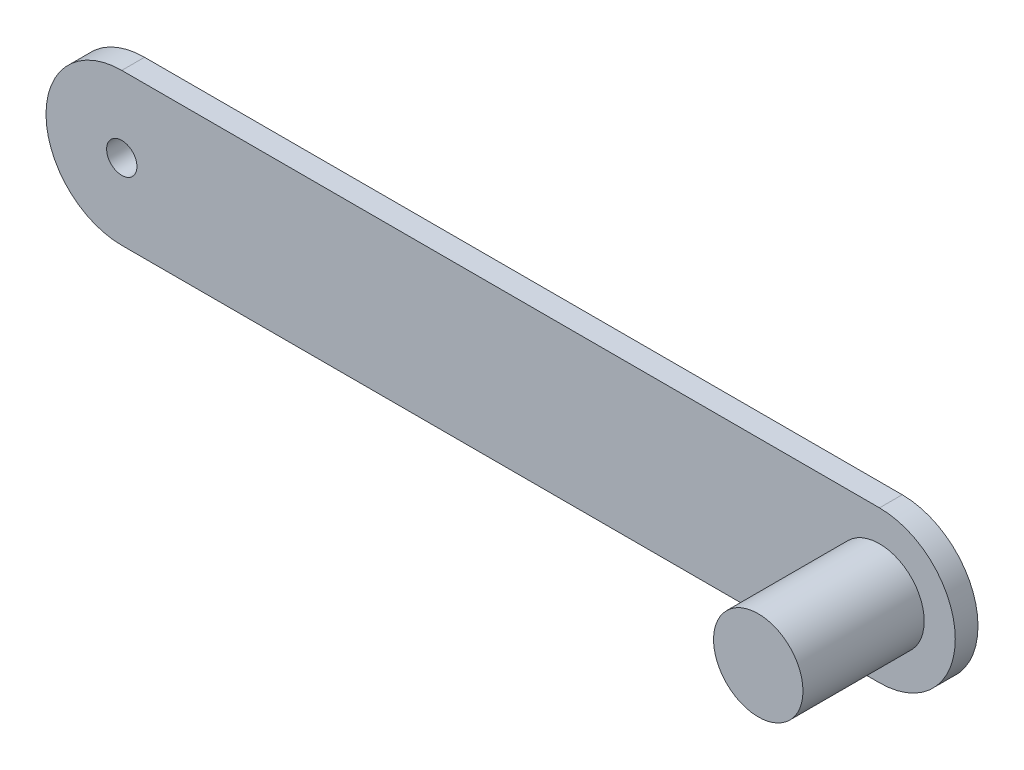
ISO-10303-21;
HEADER;
FILE_DESCRIPTION(('STEP AP214'),'2;1');
FILE_NAME('part.step','',(''),(''),'','','');
FILE_SCHEMA(('AUTOMOTIVE_DESIGN { 1 0 10303 214 1 1 1 1 }'));
ENDSEC;
DATA;
#1=APPLICATION_CONTEXT('core data for automotive mechanical design processes');
#2=APPLICATION_PROTOCOL_DEFINITION('international standard','automotive_design',2000,#1);
#3=PRODUCT_CONTEXT('',#1,'mechanical');
#4=PRODUCT('Part','Part','',(#3));
#5=PRODUCT_RELATED_PRODUCT_CATEGORY('part','',(#4));
#6=PRODUCT_DEFINITION_FORMATION('','',#4);
#7=PRODUCT_DEFINITION_CONTEXT('part definition',#1,'design');
#8=PRODUCT_DEFINITION('design','',#6,#7);
#9=PRODUCT_DEFINITION_SHAPE('','',#8);
#10=(LENGTH_UNIT() NAMED_UNIT(*) SI_UNIT(.MILLI.,.METRE.));
#11=(NAMED_UNIT(*) PLANE_ANGLE_UNIT() SI_UNIT($,.RADIAN.));
#12=(NAMED_UNIT(*) SI_UNIT($,.STERADIAN.) SOLID_ANGLE_UNIT());
#13=UNCERTAINTY_MEASURE_WITH_UNIT(LENGTH_MEASURE(1.E-05),#10,'distance_accuracy_value','');
#14=(GEOMETRIC_REPRESENTATION_CONTEXT(3) GLOBAL_UNCERTAINTY_ASSIGNED_CONTEXT((#13)) GLOBAL_UNIT_ASSIGNED_CONTEXT((#10,
#11,#12)) REPRESENTATION_CONTEXT('',''));
#15=CARTESIAN_POINT('',(0.,0.,0.));
#16=DIRECTION('',(0.,0.,1.));
#17=DIRECTION('',(1.,0.,0.));
#18=AXIS2_PLACEMENT_3D('',#15,#16,#17);
#19=CARTESIAN_POINT('',(0.,0.,1.5));
#20=DIRECTION('',(0.,0.,-1.));
#21=DIRECTION('',(-1.,0.,0.));
#22=AXIS2_PLACEMENT_3D('',#19,#20,#21);
#23=CYLINDRICAL_SURFACE('',#22,5.);
#24=CARTESIAN_POINT('',(0.,0.,0.));
#25=DIRECTION('',(0.,0.,1.));
#26=DIRECTION('',(1.,0.,0.));
#27=AXIS2_PLACEMENT_3D('',#24,#25,#26);
#28=CIRCLE('',#27,5.);
#29=CARTESIAN_POINT('',(0.,5.,0.));
#30=VERTEX_POINT('',#29);
#31=CARTESIAN_POINT('',(0.,-5.,0.));
#32=VERTEX_POINT('',#31);
#33=EDGE_CURVE('E107',#30,#32,#28,.T.);
#34=ORIENTED_EDGE('',*,*,#33,.T.);
#35=DIRECTION('',(0.,0.,-1.));
#36=VECTOR('',#35,1.);
#37=CARTESIAN_POINT('',(0.,-5.,1.5));
#38=LINE('',#37,#36);
#39=CARTESIAN_POINT('',(0.,-5.,1.5));
#40=VERTEX_POINT('',#39);
#41=EDGE_CURVE('E11',#40,#32,#38,.T.);
#42=ORIENTED_EDGE('',*,*,#41,.F.);
#43=CARTESIAN_POINT('',(0.,0.,1.5));
#44=DIRECTION('',(0.,0.,1.));
#45=DIRECTION('',(1.,0.,0.));
#46=AXIS2_PLACEMENT_3D('',#43,#44,#45);
#47=CIRCLE('',#46,5.);
#48=CARTESIAN_POINT('',(0.,5.,1.5));
#49=VERTEX_POINT('',#48);
#50=EDGE_CURVE('E91',#49,#40,#47,.T.);
#51=ORIENTED_EDGE('',*,*,#50,.F.);
#52=DIRECTION('',(0.,0.,-1.));
#53=VECTOR('',#52,1.);
#54=CARTESIAN_POINT('',(0.,5.,1.5));
#55=LINE('',#54,#53);
#56=EDGE_CURVE('E103',#49,#30,#55,.T.);
#57=ORIENTED_EDGE('',*,*,#56,.T.);
#58=EDGE_LOOP('',(#34,#42,#51,#57));
#59=FACE_BOUND('',#58,.T.);
#60=ADVANCED_FACE('F39',(#59),#23,.T.);
#61=CARTESIAN_POINT('',(0.,-5.,1.5));
#62=DIRECTION('',(0.,1.,0.));
#63=DIRECTION('',(-1.,0.,0.));
#64=AXIS2_PLACEMENT_3D('',#61,#62,#63);
#65=PLANE('',#64);
#66=DIRECTION('',(1.,0.,0.));
#67=VECTOR('',#66,1.);
#68=CARTESIAN_POINT('',(0.,-5.,0.));
#69=LINE('',#68,#67);
#70=CARTESIAN_POINT('',(50.,-5.,0.));
#71=VERTEX_POINT('',#70);
#72=EDGE_CURVE('E96',#32,#71,#69,.T.);
#73=ORIENTED_EDGE('',*,*,#72,.T.);
#74=DIRECTION('',(0.,0.,-1.));
#75=VECTOR('',#74,1.);
#76=CARTESIAN_POINT('',(50.,-5.,1.5));
#77=LINE('',#76,#75);
#78=CARTESIAN_POINT('',(50.,-5.,1.5));
#79=VERTEX_POINT('',#78);
#80=EDGE_CURVE('E48',#79,#71,#77,.T.);
#81=ORIENTED_EDGE('',*,*,#80,.F.);
#82=DIRECTION('',(1.,0.,0.));
#83=VECTOR('',#82,1.);
#84=CARTESIAN_POINT('',(0.,-5.,1.5));
#85=LINE('',#84,#83);
#86=EDGE_CURVE('E86',#40,#79,#85,.T.);
#87=ORIENTED_EDGE('',*,*,#86,.F.);
#88=ORIENTED_EDGE('',*,*,#41,.T.);
#89=EDGE_LOOP('',(#73,#81,#87,#88));
#90=FACE_BOUND('',#89,.T.);
#91=ADVANCED_FACE('F95',(#90),#65,.F.);
#92=CARTESIAN_POINT('',(50.,0.,1.5));
#93=DIRECTION('',(0.,0.,-1.));
#94=DIRECTION('',(-1.,0.,0.));
#95=AXIS2_PLACEMENT_3D('',#92,#93,#94);
#96=CYLINDRICAL_SURFACE('',#95,5.);
#97=CARTESIAN_POINT('',(50.,0.,0.));
#98=DIRECTION('',(0.,0.,1.));
#99=DIRECTION('',(1.,0.,0.));
#100=AXIS2_PLACEMENT_3D('',#97,#98,#99);
#101=CIRCLE('',#100,5.);
#102=CARTESIAN_POINT('',(50.,5.,0.));
#103=VERTEX_POINT('',#102);
#104=EDGE_CURVE('E73',#71,#103,#101,.T.);
#105=ORIENTED_EDGE('',*,*,#104,.T.);
#106=DIRECTION('',(0.,0.,-1.));
#107=VECTOR('',#106,1.);
#108=CARTESIAN_POINT('',(50.,5.,1.5));
#109=LINE('',#108,#107);
#110=CARTESIAN_POINT('',(50.,5.,1.5));
#111=VERTEX_POINT('',#110);
#112=EDGE_CURVE('E98',#111,#103,#109,.T.);
#113=ORIENTED_EDGE('',*,*,#112,.F.);
#114=CARTESIAN_POINT('',(50.,0.,1.5));
#115=DIRECTION('',(0.,0.,1.));
#116=DIRECTION('',(1.,0.,0.));
#117=AXIS2_PLACEMENT_3D('',#114,#115,#116);
#118=CIRCLE('',#117,5.);
#119=EDGE_CURVE('E89',#79,#111,#118,.T.);
#120=ORIENTED_EDGE('',*,*,#119,.F.);
#121=ORIENTED_EDGE('',*,*,#80,.T.);
#122=EDGE_LOOP('',(#105,#113,#120,#121));
#123=FACE_BOUND('',#122,.T.);
#124=ADVANCED_FACE('F99',(#123),#96,.T.);
#125=CARTESIAN_POINT('',(0.,5.,1.5));
#126=DIRECTION('',(0.,-1.,0.));
#127=DIRECTION('',(0.,0.,-1.));
#128=AXIS2_PLACEMENT_3D('',#125,#126,#127);
#129=PLANE('',#128);
#130=DIRECTION('',(-1.,0.,0.));
#131=VECTOR('',#130,1.);
#132=CARTESIAN_POINT('',(0.,5.,0.));
#133=LINE('',#132,#131);
#134=EDGE_CURVE('E79',#103,#30,#133,.T.);
#135=ORIENTED_EDGE('',*,*,#134,.T.);
#136=ORIENTED_EDGE('',*,*,#56,.F.);
#137=DIRECTION('',(-1.,0.,0.));
#138=VECTOR('',#137,1.);
#139=CARTESIAN_POINT('',(0.,5.,1.5));
#140=LINE('',#139,#138);
#141=EDGE_CURVE('E56',#111,#49,#140,.T.);
#142=ORIENTED_EDGE('',*,*,#141,.F.);
#143=ORIENTED_EDGE('',*,*,#112,.T.);
#144=EDGE_LOOP('',(#135,#136,#142,#143));
#145=FACE_BOUND('',#144,.T.);
#146=ADVANCED_FACE('F121',(#145),#129,.F.);
#147=CARTESIAN_POINT('',(0.,0.,1.5));
#148=DIRECTION('',(0.,0.,1.));
#149=DIRECTION('',(1.,0.,0.));
#150=AXIS2_PLACEMENT_3D('',#147,#148,#149);
#151=PLANE('',#150);
#152=CARTESIAN_POINT('',(50.,0.,1.5));
#153=DIRECTION('',(0.,0.,1.));
#154=DIRECTION('',(1.,0.,0.));
#155=AXIS2_PLACEMENT_3D('',#152,#153,#154);
#156=CIRCLE('',#155,2.95);
#157=CARTESIAN_POINT('',(52.95,0.,1.5));
#158=VERTEX_POINT('',#157);
#159=EDGE_CURVE('E136',#158,#158,#156,.T.);
#160=ORIENTED_EDGE('',*,*,#159,.F.);
#161=EDGE_LOOP('',(#160));
#162=FACE_BOUND('',#161,.T.);
#163=CARTESIAN_POINT('',(0.,0.,1.5));
#164=DIRECTION('',(0.,0.,1.));
#165=DIRECTION('',(1.,0.,0.));
#166=AXIS2_PLACEMENT_3D('',#163,#164,#165);
#167=CIRCLE('',#166,1.);
#168=CARTESIAN_POINT('',(1.,0.,1.5));
#169=VERTEX_POINT('',#168);
#170=EDGE_CURVE('E128',#169,#169,#167,.T.);
#171=ORIENTED_EDGE('',*,*,#170,.F.);
#172=EDGE_LOOP('',(#171));
#173=FACE_BOUND('',#172,.T.);
#174=ORIENTED_EDGE('',*,*,#50,.T.);
#175=ORIENTED_EDGE('',*,*,#86,.T.);
#176=ORIENTED_EDGE('',*,*,#119,.T.);
#177=ORIENTED_EDGE('',*,*,#141,.T.);
#178=EDGE_LOOP('',(#174,#175,#176,#177));
#179=FACE_BOUND('',#178,.T.);
#180=ADVANCED_FACE('F87',(#162,#173,#179),#151,.T.);
#181=CARTESIAN_POINT('',(0.,0.,0.));
#182=DIRECTION('',(0.,0.,1.));
#183=DIRECTION('',(1.,0.,0.));
#184=AXIS2_PLACEMENT_3D('',#181,#182,#183);
#185=PLANE('',#184);
#186=CARTESIAN_POINT('',(0.,0.,0.));
#187=DIRECTION('',(0.,0.,1.));
#188=DIRECTION('',(1.,0.,0.));
#189=AXIS2_PLACEMENT_3D('',#186,#187,#188);
#190=CIRCLE('',#189,1.);
#191=CARTESIAN_POINT('',(1.,0.,0.));
#192=VERTEX_POINT('',#191);
#193=EDGE_CURVE('E111',#192,#192,#190,.T.);
#194=ORIENTED_EDGE('',*,*,#193,.T.);
#195=EDGE_LOOP('',(#194));
#196=FACE_BOUND('',#195,.T.);
#197=ORIENTED_EDGE('',*,*,#33,.F.);
#198=ORIENTED_EDGE('',*,*,#134,.F.);
#199=ORIENTED_EDGE('',*,*,#104,.F.);
#200=ORIENTED_EDGE('',*,*,#72,.F.);
#201=EDGE_LOOP('',(#197,#198,#199,#200));
#202=FACE_BOUND('',#201,.T.);
#203=ADVANCED_FACE('F124',(#196,#202),#185,.F.);
#204=CARTESIAN_POINT('',(0.,0.,0.));
#205=DIRECTION('',(0.,0.,1.));
#206=DIRECTION('',(1.,0.,0.));
#207=AXIS2_PLACEMENT_3D('',#204,#205,#206);
#208=CYLINDRICAL_SURFACE('',#207,1.);
#209=ORIENTED_EDGE('',*,*,#193,.F.);
#210=EDGE_LOOP('',(#209));
#211=FACE_BOUND('',#210,.T.);
#212=ORIENTED_EDGE('',*,*,#170,.T.);
#213=EDGE_LOOP('',(#212));
#214=FACE_BOUND('',#213,.T.);
#215=ADVANCED_FACE('F149',(#211,#214),#208,.F.);
#216=CARTESIAN_POINT('',(50.,0.,9.5));
#217=DIRECTION('',(0.,0.,-1.));
#218=DIRECTION('',(-1.,0.,0.));
#219=AXIS2_PLACEMENT_3D('',#216,#217,#218);
#220=CYLINDRICAL_SURFACE('',#219,2.95);
#221=CARTESIAN_POINT('',(50.,0.,9.5));
#222=DIRECTION('',(0.,0.,1.));
#223=DIRECTION('',(1.,0.,0.));
#224=AXIS2_PLACEMENT_3D('',#221,#222,#223);
#225=CIRCLE('',#224,2.95);
#226=CARTESIAN_POINT('',(52.95,0.,9.5));
#227=VERTEX_POINT('',#226);
#228=EDGE_CURVE('E132',#227,#227,#225,.T.);
#229=ORIENTED_EDGE('',*,*,#228,.F.);
#230=EDGE_LOOP('',(#229));
#231=FACE_BOUND('',#230,.T.);
#232=ORIENTED_EDGE('',*,*,#159,.T.);
#233=EDGE_LOOP('',(#232));
#234=FACE_BOUND('',#233,.T.);
#235=ADVANCED_FACE('F146',(#231,#234),#220,.T.);
#236=CARTESIAN_POINT('',(50.,0.,9.5));
#237=DIRECTION('',(0.,0.,1.));
#238=DIRECTION('',(1.,0.,0.));
#239=AXIS2_PLACEMENT_3D('',#236,#237,#238);
#240=PLANE('',#239);
#241=ORIENTED_EDGE('',*,*,#228,.T.);
#242=EDGE_LOOP('',(#241));
#243=FACE_BOUND('',#242,.T.);
#244=ADVANCED_FACE('F144',(#243),#240,.T.);
#245=CLOSED_SHELL('',(#60,#91,#124,#146,#180,#203,#215,#235,#244));
#246=MANIFOLD_SOLID_BREP('B2',#245);
#247=ADVANCED_BREP_SHAPE_REPRESENTATION('',(#18,#246),#14);
#248=SHAPE_DEFINITION_REPRESENTATION(#9,#247);
ENDSEC;
END-ISO-10303-21;
